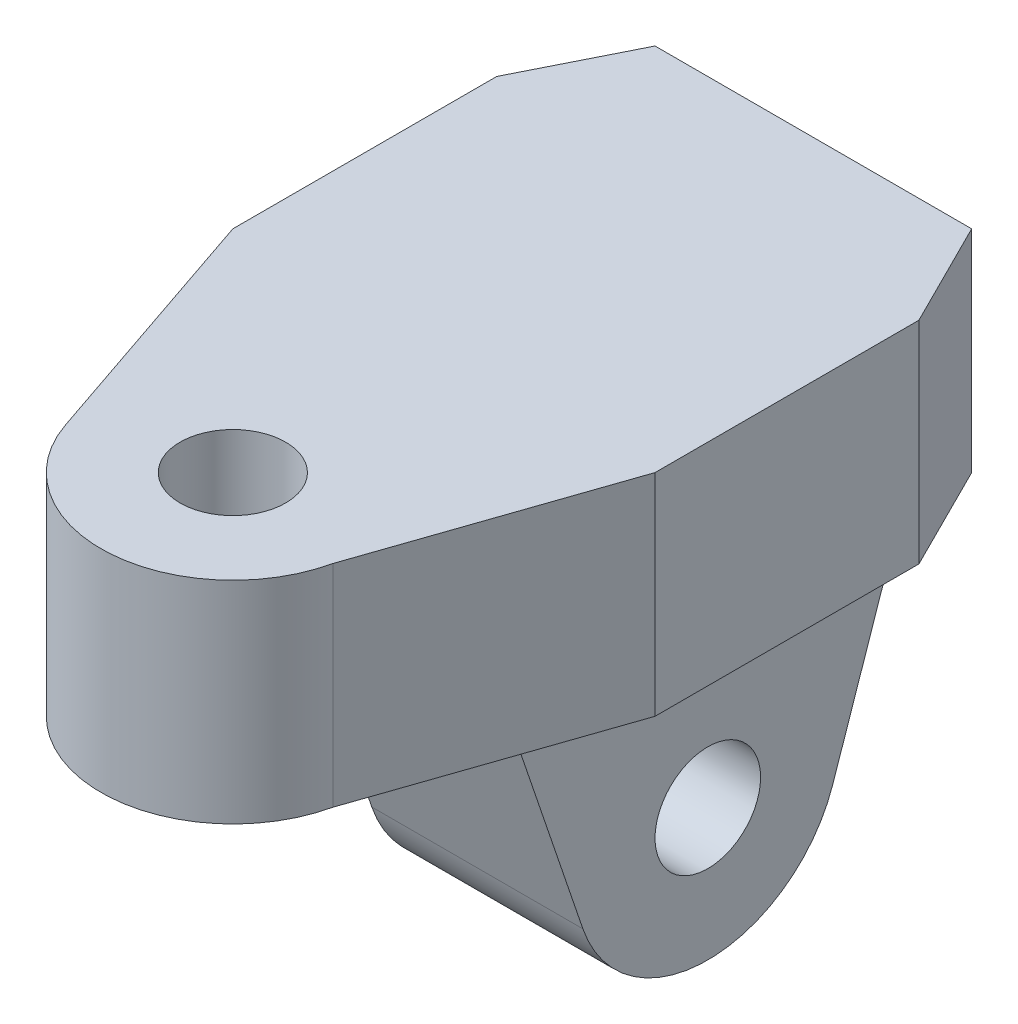
ISO-10303-21;
HEADER;
FILE_DESCRIPTION(('STEP AP214'),'2;1');
FILE_NAME('part.step','',(''),(''),'','','');
FILE_SCHEMA(('AUTOMOTIVE_DESIGN { 1 0 10303 214 1 1 1 1 }'));
ENDSEC;
DATA;
#1=APPLICATION_CONTEXT('core data for automotive mechanical design processes');
#2=APPLICATION_PROTOCOL_DEFINITION('international standard','automotive_design',2000,#1);
#3=PRODUCT_CONTEXT('',#1,'mechanical');
#4=PRODUCT('Part','Part','',(#3));
#5=PRODUCT_RELATED_PRODUCT_CATEGORY('part','',(#4));
#6=PRODUCT_DEFINITION_FORMATION('','',#4);
#7=PRODUCT_DEFINITION_CONTEXT('part definition',#1,'design');
#8=PRODUCT_DEFINITION('design','',#6,#7);
#9=PRODUCT_DEFINITION_SHAPE('','',#8);
#10=(LENGTH_UNIT() NAMED_UNIT(*) SI_UNIT(.MILLI.,.METRE.));
#11=(NAMED_UNIT(*) PLANE_ANGLE_UNIT() SI_UNIT($,.RADIAN.));
#12=(NAMED_UNIT(*) SI_UNIT($,.STERADIAN.) SOLID_ANGLE_UNIT());
#13=UNCERTAINTY_MEASURE_WITH_UNIT(LENGTH_MEASURE(1.E-05),#10,'distance_accuracy_value','');
#14=(GEOMETRIC_REPRESENTATION_CONTEXT(3) GLOBAL_UNCERTAINTY_ASSIGNED_CONTEXT((#13)) GLOBAL_UNIT_ASSIGNED_CONTEXT((#10,
#11,#12)) REPRESENTATION_CONTEXT('',''));
#15=CARTESIAN_POINT('',(0.,0.,0.));
#16=DIRECTION('',(0.,0.,1.));
#17=DIRECTION('',(1.,0.,0.));
#18=AXIS2_PLACEMENT_3D('',#15,#16,#17);
#19=CARTESIAN_POINT('',(0.,0.,-6.));
#20=DIRECTION('',(0.,0.,-1.));
#21=DIRECTION('',(0.,1.,0.));
#22=AXIS2_PLACEMENT_3D('',#19,#20,#21);
#23=PLANE('',#22);
#24=DIRECTION('',(-0.707106781186541,0.707106781186554,0.));
#25=VECTOR('',#24,1.);
#26=CARTESIAN_POINT('',(-9.,12.,-6.));
#27=LINE('',#26,#25);
#28=CARTESIAN_POINT('',(-6.,8.99999999999995,-6.));
#29=VERTEX_POINT('',#28);
#30=CARTESIAN_POINT('',(-9.,12.,-6.));
#31=VERTEX_POINT('',#30);
#32=EDGE_CURVE('E205',#29,#31,#27,.T.);
#33=ORIENTED_EDGE('',*,*,#32,.T.);
#34=DIRECTION('',(1.,0.,0.));
#35=VECTOR('',#34,1.);
#36=CARTESIAN_POINT('',(0.,12.,-6.));
#37=LINE('',#36,#35);
#38=CARTESIAN_POINT('',(-6.,12.,-6.));
#39=VERTEX_POINT('',#38);
#40=EDGE_CURVE('E11',#31,#39,#37,.T.);
#41=ORIENTED_EDGE('',*,*,#40,.T.);
#42=DIRECTION('',(0.,-1.,0.));
#43=VECTOR('',#42,1.);
#44=CARTESIAN_POINT('',(-6.,8.99999999999995,-6.));
#45=LINE('',#44,#43);
#46=EDGE_CURVE('E202',#39,#29,#45,.T.);
#47=ORIENTED_EDGE('',*,*,#46,.T.);
#48=EDGE_LOOP('',(#33,#41,#47));
#49=FACE_BOUND('',#48,.T.);
#50=ADVANCED_FACE('F33',(#49),#23,.T.);
#51=DIRECTION('',(0.,1.,0.));
#52=VECTOR('',#51,1.);
#53=CARTESIAN_POINT('',(6.,9.00000000000007,-6.));
#54=LINE('',#53,#52);
#55=CARTESIAN_POINT('',(6.,9.00000000000008,-6.));
#56=VERTEX_POINT('',#55);
#57=CARTESIAN_POINT('',(6.,12.,-6.));
#58=VERTEX_POINT('',#57);
#59=EDGE_CURVE('E48',#56,#58,#54,.T.);
#60=ORIENTED_EDGE('',*,*,#59,.T.);
#61=CARTESIAN_POINT('',(9.,12.,-6.));
#62=VERTEX_POINT('',#61);
#63=EDGE_CURVE('E37',#58,#62,#37,.T.);
#64=ORIENTED_EDGE('',*,*,#63,.T.);
#65=DIRECTION('',(-0.707106781186556,-0.707106781186539,0.));
#66=VECTOR('',#65,1.);
#67=CARTESIAN_POINT('',(9.,12.,-6.));
#68=LINE('',#67,#66);
#69=EDGE_CURVE('E198',#62,#56,#68,.T.);
#70=ORIENTED_EDGE('',*,*,#69,.T.);
#71=EDGE_LOOP('',(#60,#64,#70));
#72=FACE_BOUND('',#71,.T.);
#73=ADVANCED_FACE('F311',(#72),#23,.T.);
#74=CARTESIAN_POINT('',(6.,0.,0.));
#75=DIRECTION('',(1.,0.,0.));
#76=DIRECTION('',(0.,0.,-1.));
#77=AXIS2_PLACEMENT_3D('',#74,#75,#76);
#78=PLANE('',#77);
#79=ORIENTED_EDGE('',*,*,#59,.F.);
#80=DIRECTION('',(0.,0.,1.));
#81=VECTOR('',#80,1.);
#82=CARTESIAN_POINT('',(6.,9.00000000000007,-6.));
#83=LINE('',#82,#81);
#84=CARTESIAN_POINT('',(6.,8.99999999999995,6.));
#85=VERTEX_POINT('',#84);
#86=EDGE_CURVE('E53',#56,#85,#83,.T.);
#87=ORIENTED_EDGE('',*,*,#86,.T.);
#88=DIRECTION('',(0.,1.,0.));
#89=VECTOR('',#88,1.);
#90=CARTESIAN_POINT('',(6.,9.00000000000007,6.));
#91=LINE('',#90,#89);
#92=CARTESIAN_POINT('',(6.,12.,6.));
#93=VERTEX_POINT('',#92);
#94=EDGE_CURVE('E212',#85,#93,#91,.T.);
#95=ORIENTED_EDGE('',*,*,#94,.T.);
#96=DIRECTION('',(0.,0.,1.));
#97=VECTOR('',#96,1.);
#98=CARTESIAN_POINT('',(6.,12.,12.));
#99=LINE('',#98,#97);
#100=CARTESIAN_POINT('',(6.,12.,12.));
#101=VERTEX_POINT('',#100);
#102=EDGE_CURVE('E285',#93,#101,#99,.T.);
#103=ORIENTED_EDGE('',*,*,#102,.T.);
#104=DIRECTION('',(0.,-0.946805722818264,-0.321805722818264));
#105=VECTOR('',#104,1.);
#106=CARTESIAN_POINT('',(6.,12.,12.));
#107=LINE('',#106,#105);
#108=CARTESIAN_POINT('',(6.,-2.41354292113698,7.10104292113698));
#109=VERTEX_POINT('',#108);
#110=EDGE_CURVE('E277',#101,#109,#107,.T.);
#111=ORIENTED_EDGE('',*,*,#110,.T.);
#112=CARTESIAN_POINT('',(6.,0.,0.));
#113=DIRECTION('',(1.,0.,0.));
#114=DIRECTION('',(0.,0.,-1.));
#115=AXIS2_PLACEMENT_3D('',#112,#113,#114);
#116=CIRCLE('',#115,7.5);
#117=CARTESIAN_POINT('',(6.,-2.41354292113698,-7.10104292113697));
#118=VERTEX_POINT('',#117);
#119=EDGE_CURVE('E280',#109,#118,#116,.T.);
#120=ORIENTED_EDGE('',*,*,#119,.T.);
#121=DIRECTION('',(0.,0.946805722818264,-0.321805722818264));
#122=VECTOR('',#121,1.);
#123=CARTESIAN_POINT('',(6.,12.,-12.));
#124=LINE('',#123,#122);
#125=CARTESIAN_POINT('',(6.,12.,-12.));
#126=VERTEX_POINT('',#125);
#127=EDGE_CURVE('E283',#118,#126,#124,.T.);
#128=ORIENTED_EDGE('',*,*,#127,.T.);
#129=EDGE_CURVE('E286',#126,#58,#99,.T.);
#130=ORIENTED_EDGE('',*,*,#129,.T.);
#131=EDGE_LOOP('',(#79,#87,#95,#103,#111,#120,#128,#130));
#132=FACE_BOUND('',#131,.T.);
#133=CARTESIAN_POINT('',(6.,0.,0.));
#134=DIRECTION('',(1.,0.,0.));
#135=DIRECTION('',(0.,0.,-1.));
#136=AXIS2_PLACEMENT_3D('',#133,#134,#135);
#137=CIRCLE('',#136,3.);
#138=CARTESIAN_POINT('',(6.,0.,-3.));
#139=VERTEX_POINT('',#138);
#140=EDGE_CURVE('E271',#139,#139,#137,.T.);
#141=ORIENTED_EDGE('',*,*,#140,.F.);
#142=EDGE_LOOP('',(#141));
#143=FACE_BOUND('',#142,.T.);
#144=ADVANCED_FACE('F324',(#132,#143),#78,.T.);
#145=CARTESIAN_POINT('',(-6.,0.,0.));
#146=DIRECTION('',(1.,0.,0.));
#147=DIRECTION('',(0.,0.,-1.));
#148=AXIS2_PLACEMENT_3D('',#145,#146,#147);
#149=PLANE('',#148);
#150=DIRECTION('',(0.,0.,1.));
#151=VECTOR('',#150,1.);
#152=CARTESIAN_POINT('',(-6.,8.99999999999995,-6.));
#153=LINE('',#152,#151);
#154=CARTESIAN_POINT('',(-6.,8.99999999999995,6.));
#155=VERTEX_POINT('',#154);
#156=EDGE_CURVE('E220',#29,#155,#153,.T.);
#157=ORIENTED_EDGE('',*,*,#156,.F.);
#158=ORIENTED_EDGE('',*,*,#46,.F.);
#159=DIRECTION('',(0.,0.,1.));
#160=VECTOR('',#159,1.);
#161=CARTESIAN_POINT('',(-6.,12.,12.));
#162=LINE('',#161,#160);
#163=CARTESIAN_POINT('',(-6.,12.,-12.));
#164=VERTEX_POINT('',#163);
#165=EDGE_CURVE('E281',#164,#39,#162,.T.);
#166=ORIENTED_EDGE('',*,*,#165,.F.);
#167=DIRECTION('',(0.,0.946805722818264,-0.321805722818264));
#168=VECTOR('',#167,1.);
#169=CARTESIAN_POINT('',(-6.,12.,-12.));
#170=LINE('',#169,#168);
#171=CARTESIAN_POINT('',(-6.,-2.41354292113698,-7.10104292113697));
#172=VERTEX_POINT('',#171);
#173=EDGE_CURVE('E293',#172,#164,#170,.T.);
#174=ORIENTED_EDGE('',*,*,#173,.F.);
#175=CARTESIAN_POINT('',(-6.,0.,0.));
#176=DIRECTION('',(1.,0.,0.));
#177=DIRECTION('',(0.,0.,-1.));
#178=AXIS2_PLACEMENT_3D('',#175,#176,#177);
#179=CIRCLE('',#178,7.5);
#180=CARTESIAN_POINT('',(-6.,-2.41354292113698,7.10104292113698));
#181=VERTEX_POINT('',#180);
#182=EDGE_CURVE('E291',#181,#172,#179,.T.);
#183=ORIENTED_EDGE('',*,*,#182,.F.);
#184=DIRECTION('',(0.,-0.946805722818264,-0.321805722818264));
#185=VECTOR('',#184,1.);
#186=CARTESIAN_POINT('',(-6.,12.,12.));
#187=LINE('',#186,#185);
#188=CARTESIAN_POINT('',(-6.,12.,12.));
#189=VERTEX_POINT('',#188);
#190=EDGE_CURVE('E274',#189,#181,#187,.T.);
#191=ORIENTED_EDGE('',*,*,#190,.F.);
#192=CARTESIAN_POINT('',(-5.99999999999999,12.,6.));
#193=VERTEX_POINT('',#192);
#194=EDGE_CURVE('E295',#193,#189,#162,.T.);
#195=ORIENTED_EDGE('',*,*,#194,.F.);
#196=DIRECTION('',(0.,-1.,0.));
#197=VECTOR('',#196,1.);
#198=CARTESIAN_POINT('',(-6.,8.99999999999995,6.));
#199=LINE('',#198,#197);
#200=EDGE_CURVE('E214',#193,#155,#199,.T.);
#201=ORIENTED_EDGE('',*,*,#200,.T.);
#202=EDGE_LOOP('',(#157,#158,#166,#174,#183,#191,#195,#201));
#203=FACE_BOUND('',#202,.T.);
#204=CARTESIAN_POINT('',(-6.,0.,0.));
#205=DIRECTION('',(1.,0.,0.));
#206=DIRECTION('',(0.,0.,-1.));
#207=AXIS2_PLACEMENT_3D('',#204,#205,#206);
#208=CIRCLE('',#207,3.);
#209=CARTESIAN_POINT('',(-6.,0.,-3.));
#210=VERTEX_POINT('',#209);
#211=EDGE_CURVE('E270',#210,#210,#208,.T.);
#212=ORIENTED_EDGE('',*,*,#211,.T.);
#213=EDGE_LOOP('',(#212));
#214=FACE_BOUND('',#213,.T.);
#215=ADVANCED_FACE('F333',(#203,#214),#149,.F.);
#216=CARTESIAN_POINT('',(6.,12.,12.));
#217=DIRECTION('',(0.,0.321805722818264,-0.946805722818264));
#218=DIRECTION('',(0.,0.946805722818264,0.321805722818264));
#219=AXIS2_PLACEMENT_3D('',#216,#217,#218);
#220=PLANE('',#219);
#221=ORIENTED_EDGE('',*,*,#190,.T.);
#222=DIRECTION('',(-1.,0.,0.));
#223=VECTOR('',#222,1.);
#224=CARTESIAN_POINT('',(6.,-2.41354292113698,7.10104292113698));
#225=LINE('',#224,#223);
#226=EDGE_CURVE('E304',#109,#181,#225,.T.);
#227=ORIENTED_EDGE('',*,*,#226,.F.);
#228=ORIENTED_EDGE('',*,*,#110,.F.);
#229=DIRECTION('',(-1.,0.,0.));
#230=VECTOR('',#229,1.);
#231=CARTESIAN_POINT('',(6.,12.,12.));
#232=LINE('',#231,#230);
#233=EDGE_CURVE('E288',#101,#189,#232,.T.);
#234=ORIENTED_EDGE('',*,*,#233,.T.);
#235=EDGE_LOOP('',(#221,#227,#228,#234));
#236=FACE_BOUND('',#235,.T.);
#237=ADVANCED_FACE('F35',(#236),#220,.F.);
#238=CARTESIAN_POINT('',(6.,0.,0.));
#239=DIRECTION('',(-1.,0.,0.));
#240=DIRECTION('',(0.,0.,1.));
#241=AXIS2_PLACEMENT_3D('',#238,#239,#240);
#242=CYLINDRICAL_SURFACE('',#241,7.5);
#243=ORIENTED_EDGE('',*,*,#182,.T.);
#244=DIRECTION('',(-1.,0.,0.));
#245=VECTOR('',#244,1.);
#246=CARTESIAN_POINT('',(6.,-2.41354292113698,-7.10104292113697));
#247=LINE('',#246,#245);
#248=EDGE_CURVE('E302',#118,#172,#247,.T.);
#249=ORIENTED_EDGE('',*,*,#248,.F.);
#250=ORIENTED_EDGE('',*,*,#119,.F.);
#251=ORIENTED_EDGE('',*,*,#226,.T.);
#252=EDGE_LOOP('',(#243,#249,#250,#251));
#253=FACE_BOUND('',#252,.T.);
#254=ADVANCED_FACE('F338',(#253),#242,.T.);
#255=CARTESIAN_POINT('',(6.,12.,-12.));
#256=DIRECTION('',(0.,0.321805722818264,0.946805722818264));
#257=DIRECTION('',(0.,-0.946805722818264,0.321805722818264));
#258=AXIS2_PLACEMENT_3D('',#255,#256,#257);
#259=PLANE('',#258);
#260=ORIENTED_EDGE('',*,*,#173,.T.);
#261=DIRECTION('',(-1.,0.,0.));
#262=VECTOR('',#261,1.);
#263=CARTESIAN_POINT('',(6.,12.,-12.));
#264=LINE('',#263,#262);
#265=EDGE_CURVE('E299',#126,#164,#264,.T.);
#266=ORIENTED_EDGE('',*,*,#265,.F.);
#267=ORIENTED_EDGE('',*,*,#127,.F.);
#268=ORIENTED_EDGE('',*,*,#248,.T.);
#269=EDGE_LOOP('',(#260,#266,#267,#268));
#270=FACE_BOUND('',#269,.T.);
#271=ADVANCED_FACE('F341',(#270),#259,.F.);
#272=CARTESIAN_POINT('',(6.,0.,0.));
#273=DIRECTION('',(-1.,0.,0.));
#274=DIRECTION('',(0.,0.,1.));
#275=AXIS2_PLACEMENT_3D('',#272,#273,#274);
#276=CYLINDRICAL_SURFACE('',#275,3.);
#277=ORIENTED_EDGE('',*,*,#140,.T.);
#278=EDGE_LOOP('',(#277));
#279=FACE_BOUND('',#278,.T.);
#280=ORIENTED_EDGE('',*,*,#211,.F.);
#281=EDGE_LOOP('',(#280));
#282=FACE_BOUND('',#281,.T.);
#283=ADVANCED_FACE('F452',(#279,#282),#276,.F.);
#284=CARTESIAN_POINT('',(0.,12.,21.));
#285=DIRECTION('',(0.,1.,0.));
#286=DIRECTION('',(0.,0.,1.));
#287=AXIS2_PLACEMENT_3D('',#284,#285,#286);
#288=PLANE('',#287);
#289=CARTESIAN_POINT('',(0.,12.,21.));
#290=DIRECTION('',(0.,1.,0.));
#291=DIRECTION('',(0.,0.,1.));
#292=AXIS2_PLACEMENT_3D('',#289,#290,#291);
#293=CIRCLE('',#292,3.);
#294=CARTESIAN_POINT('',(0.,12.,24.));
#295=VERTEX_POINT('',#294);
#296=EDGE_CURVE('E238',#295,#295,#293,.T.);
#297=ORIENTED_EDGE('',*,*,#296,.T.);
#298=EDGE_LOOP('',(#297));
#299=FACE_BOUND('',#298,.T.);
#300=DIRECTION('',(0.321805722818264,0.,0.946805722818264));
#301=VECTOR('',#300,1.);
#302=CARTESIAN_POINT('',(-12.,12.,9.));
#303=LINE('',#302,#301);
#304=CARTESIAN_POINT('',(-12.,12.,9.));
#305=VERTEX_POINT('',#304);
#306=CARTESIAN_POINT('',(-7.10104292113698,12.,23.413542921137));
#307=VERTEX_POINT('',#306);
#308=EDGE_CURVE('E242',#305,#307,#303,.T.);
#309=ORIENTED_EDGE('',*,*,#308,.F.);
#310=DIRECTION('',(0.,0.,1.));
#311=VECTOR('',#310,1.);
#312=CARTESIAN_POINT('',(-12.,12.,6.));
#313=LINE('',#312,#311);
#314=CARTESIAN_POINT('',(-12.,12.,-6.));
#315=VERTEX_POINT('',#314);
#316=EDGE_CURVE('E234',#315,#305,#313,.T.);
#317=ORIENTED_EDGE('',*,*,#316,.F.);
#318=DIRECTION('',(-0.447213595499958,0.,0.894427190999916));
#319=VECTOR('',#318,1.);
#320=CARTESIAN_POINT('',(-9.,12.,-12.));
#321=LINE('',#320,#319);
#322=CARTESIAN_POINT('',(-9.,12.,-12.));
#323=VERTEX_POINT('',#322);
#324=EDGE_CURVE('E189',#323,#315,#321,.T.);
#325=ORIENTED_EDGE('',*,*,#324,.F.);
#326=DIRECTION('',(-1.,0.,0.));
#327=VECTOR('',#326,1.);
#328=CARTESIAN_POINT('',(9.,12.,-12.));
#329=LINE('',#328,#327);
#330=EDGE_CURVE('E193',#164,#323,#329,.T.);
#331=ORIENTED_EDGE('',*,*,#330,.F.);
#332=ORIENTED_EDGE('',*,*,#165,.T.);
#333=ORIENTED_EDGE('',*,*,#40,.F.);
#334=DIRECTION('',(0.,0.,1.));
#335=VECTOR('',#334,1.);
#336=CARTESIAN_POINT('',(-9.,12.,-6.));
#337=LINE('',#336,#335);
#338=CARTESIAN_POINT('',(-8.99999999999999,12.,6.));
#339=VERTEX_POINT('',#338);
#340=EDGE_CURVE('E210',#31,#339,#337,.T.);
#341=ORIENTED_EDGE('',*,*,#340,.T.);
#342=DIRECTION('',(-1.,0.,0.));
#343=VECTOR('',#342,1.);
#344=CARTESIAN_POINT('',(12.,12.,6.));
#345=LINE('',#344,#343);
#346=EDGE_CURVE('E227',#193,#339,#345,.T.);
#347=ORIENTED_EDGE('',*,*,#346,.F.);
#348=ORIENTED_EDGE('',*,*,#194,.T.);
#349=ORIENTED_EDGE('',*,*,#233,.F.);
#350=ORIENTED_EDGE('',*,*,#102,.F.);
#351=CARTESIAN_POINT('',(9.,12.,6.));
#352=VERTEX_POINT('',#351);
#353=EDGE_CURVE('E228',#352,#93,#345,.T.);
#354=ORIENTED_EDGE('',*,*,#353,.F.);
#355=DIRECTION('',(0.,0.,1.));
#356=VECTOR('',#355,1.);
#357=CARTESIAN_POINT('',(9.,12.,-6.));
#358=LINE('',#357,#356);
#359=EDGE_CURVE('E224',#62,#352,#358,.T.);
#360=ORIENTED_EDGE('',*,*,#359,.F.);
#361=ORIENTED_EDGE('',*,*,#63,.F.);
#362=ORIENTED_EDGE('',*,*,#129,.F.);
#363=CARTESIAN_POINT('',(9.,12.,-12.));
#364=VERTEX_POINT('',#363);
#365=EDGE_CURVE('E194',#364,#126,#329,.T.);
#366=ORIENTED_EDGE('',*,*,#365,.F.);
#367=DIRECTION('',(-0.447213595499958,0.,-0.894427190999916));
#368=VECTOR('',#367,1.);
#369=CARTESIAN_POINT('',(12.,12.,-6.));
#370=LINE('',#369,#368);
#371=CARTESIAN_POINT('',(12.,12.,-6.));
#372=VERTEX_POINT('',#371);
#373=EDGE_CURVE('E175',#372,#364,#370,.T.);
#374=ORIENTED_EDGE('',*,*,#373,.F.);
#375=DIRECTION('',(0.,0.,1.));
#376=VECTOR('',#375,1.);
#377=CARTESIAN_POINT('',(12.,12.,6.));
#378=LINE('',#377,#376);
#379=CARTESIAN_POINT('',(12.,12.,9.));
#380=VERTEX_POINT('',#379);
#381=EDGE_CURVE('E236',#372,#380,#378,.T.);
#382=ORIENTED_EDGE('',*,*,#381,.T.);
#383=DIRECTION('',(0.324651995250833,0.,-0.945833538197739));
#384=VECTOR('',#383,1.);
#385=CARTESIAN_POINT('',(12.,12.,9.));
#386=LINE('',#385,#384);
#387=CARTESIAN_POINT('',(7.31915304326845,12.,22.6370701662465));
#388=VERTEX_POINT('',#387);
#389=EDGE_CURVE('E248',#388,#380,#386,.T.);
#390=ORIENTED_EDGE('',*,*,#389,.F.);
#391=CARTESIAN_POINT('',(0.,12.,21.));
#392=DIRECTION('',(0.,1.,0.));
#393=DIRECTION('',(0.,0.,1.));
#394=AXIS2_PLACEMENT_3D('',#391,#392,#393);
#395=CIRCLE('',#394,7.5);
#396=EDGE_CURVE('E255',#307,#388,#395,.T.);
#397=ORIENTED_EDGE('',*,*,#396,.F.);
#398=EDGE_LOOP('',(#309,#317,#325,#331,#332,#333,#341,#347,#348,#349,#350,#354,#360,#361,#362,
#366,#374,#382,#390,#397));
#399=FACE_BOUND('',#398,.T.);
#400=ADVANCED_FACE('F316',(#299,#399),#288,.F.);
#401=CARTESIAN_POINT('',(0.,24.,21.));
#402=DIRECTION('',(0.,1.,0.));
#403=DIRECTION('',(0.,0.,1.));
#404=AXIS2_PLACEMENT_3D('',#401,#402,#403);
#405=PLANE('',#404);
#406=DIRECTION('',(0.321805722818264,0.,0.946805722818264));
#407=VECTOR('',#406,1.);
#408=CARTESIAN_POINT('',(-12.,24.,9.00000000000001));
#409=LINE('',#408,#407);
#410=CARTESIAN_POINT('',(-12.,24.,9.00000000000001));
#411=VERTEX_POINT('',#410);
#412=CARTESIAN_POINT('',(-7.10104292113698,24.,23.413542921137));
#413=VERTEX_POINT('',#412);
#414=EDGE_CURVE('E245',#411,#413,#409,.T.);
#415=ORIENTED_EDGE('',*,*,#414,.T.);
#416=CARTESIAN_POINT('',(0.,24.,21.));
#417=DIRECTION('',(0.,1.,0.));
#418=DIRECTION('',(0.,0.,1.));
#419=AXIS2_PLACEMENT_3D('',#416,#417,#418);
#420=CIRCLE('',#419,7.5);
#421=CARTESIAN_POINT('',(7.31915304326845,24.,22.6370701662465));
#422=VERTEX_POINT('',#421);
#423=EDGE_CURVE('E247',#413,#422,#420,.T.);
#424=ORIENTED_EDGE('',*,*,#423,.T.);
#425=DIRECTION('',(0.324651995250833,0.,-0.945833538197739));
#426=VECTOR('',#425,1.);
#427=CARTESIAN_POINT('',(12.,24.,9.00000000000001));
#428=LINE('',#427,#426);
#429=CARTESIAN_POINT('',(12.,24.,9.00000000000001));
#430=VERTEX_POINT('',#429);
#431=EDGE_CURVE('E250',#422,#430,#428,.T.);
#432=ORIENTED_EDGE('',*,*,#431,.T.);
#433=DIRECTION('',(0.,0.,1.));
#434=VECTOR('',#433,1.);
#435=CARTESIAN_POINT('',(12.,24.,6.));
#436=LINE('',#435,#434);
#437=CARTESIAN_POINT('',(12.,24.,-6.));
#438=VERTEX_POINT('',#437);
#439=EDGE_CURVE('E165',#438,#430,#436,.T.);
#440=ORIENTED_EDGE('',*,*,#439,.F.);
#441=DIRECTION('',(-0.447213595499958,0.,-0.894427190999916));
#442=VECTOR('',#441,1.);
#443=CARTESIAN_POINT('',(12.,24.,-6.));
#444=LINE('',#443,#442);
#445=CARTESIAN_POINT('',(9.,24.,-12.));
#446=VERTEX_POINT('',#445);
#447=EDGE_CURVE('E155',#438,#446,#444,.T.);
#448=ORIENTED_EDGE('',*,*,#447,.T.);
#449=DIRECTION('',(-1.,0.,0.));
#450=VECTOR('',#449,1.);
#451=CARTESIAN_POINT('',(9.,24.,-12.));
#452=LINE('',#451,#450);
#453=CARTESIAN_POINT('',(-9.,24.,-12.));
#454=VERTEX_POINT('',#453);
#455=EDGE_CURVE('E162',#446,#454,#452,.T.);
#456=ORIENTED_EDGE('',*,*,#455,.T.);
#457=DIRECTION('',(-0.447213595499958,0.,0.894427190999916));
#458=VECTOR('',#457,1.);
#459=CARTESIAN_POINT('',(-9.,24.,-12.));
#460=LINE('',#459,#458);
#461=CARTESIAN_POINT('',(-12.,24.,-6.));
#462=VERTEX_POINT('',#461);
#463=EDGE_CURVE('E169',#454,#462,#460,.T.);
#464=ORIENTED_EDGE('',*,*,#463,.T.);
#465=DIRECTION('',(0.,0.,1.));
#466=VECTOR('',#465,1.);
#467=CARTESIAN_POINT('',(-12.,24.,6.));
#468=LINE('',#467,#466);
#469=EDGE_CURVE('E232',#462,#411,#468,.T.);
#470=ORIENTED_EDGE('',*,*,#469,.T.);
#471=EDGE_LOOP('',(#415,#424,#432,#440,#448,#456,#464,#470));
#472=FACE_BOUND('',#471,.T.);
#473=CARTESIAN_POINT('',(0.,24.,21.));
#474=DIRECTION('',(0.,1.,0.));
#475=DIRECTION('',(0.,0.,1.));
#476=AXIS2_PLACEMENT_3D('',#473,#474,#475);
#477=CIRCLE('',#476,3.);
#478=CARTESIAN_POINT('',(0.,24.,24.));
#479=VERTEX_POINT('',#478);
#480=EDGE_CURVE('E239',#479,#479,#477,.T.);
#481=ORIENTED_EDGE('',*,*,#480,.F.);
#482=EDGE_LOOP('',(#481));
#483=FACE_BOUND('',#482,.T.);
#484=ADVANCED_FACE('F158',(#472,#483),#405,.T.);
#485=CARTESIAN_POINT('',(-12.,24.,9.00000000000001));
#486=DIRECTION('',(0.946805722818264,0.,-0.321805722818264));
#487=DIRECTION('',(-0.321805722818264,0.,-0.946805722818264));
#488=AXIS2_PLACEMENT_3D('',#485,#486,#487);
#489=PLANE('',#488);
#490=ORIENTED_EDGE('',*,*,#308,.T.);
#491=DIRECTION('',(0.,-1.,0.));
#492=VECTOR('',#491,1.);
#493=CARTESIAN_POINT('',(-7.10104292113698,24.,23.413542921137));
#494=LINE('',#493,#492);
#495=EDGE_CURVE('E267',#413,#307,#494,.T.);
#496=ORIENTED_EDGE('',*,*,#495,.F.);
#497=ORIENTED_EDGE('',*,*,#414,.F.);
#498=DIRECTION('',(0.,-1.,0.));
#499=VECTOR('',#498,1.);
#500=CARTESIAN_POINT('',(-12.,24.,9.00000000000001));
#501=LINE('',#500,#499);
#502=EDGE_CURVE('E252',#411,#305,#501,.T.);
#503=ORIENTED_EDGE('',*,*,#502,.T.);
#504=EDGE_LOOP('',(#490,#496,#497,#503));
#505=FACE_BOUND('',#504,.T.);
#506=ADVANCED_FACE('F358',(#505),#489,.F.);
#507=CARTESIAN_POINT('',(0.,24.,21.));
#508=DIRECTION('',(0.,-1.,0.));
#509=DIRECTION('',(0.,0.,-1.));
#510=AXIS2_PLACEMENT_3D('',#507,#508,#509);
#511=CYLINDRICAL_SURFACE('',#510,7.5);
#512=ORIENTED_EDGE('',*,*,#396,.T.);
#513=DIRECTION('',(0.,-1.,0.));
#514=VECTOR('',#513,1.);
#515=CARTESIAN_POINT('',(7.31915304326845,24.,22.6370701662465));
#516=LINE('',#515,#514);
#517=EDGE_CURVE('E264',#422,#388,#516,.T.);
#518=ORIENTED_EDGE('',*,*,#517,.F.);
#519=ORIENTED_EDGE('',*,*,#423,.F.);
#520=ORIENTED_EDGE('',*,*,#495,.T.);
#521=EDGE_LOOP('',(#512,#518,#519,#520));
#522=FACE_BOUND('',#521,.T.);
#523=ADVANCED_FACE('F353',(#522),#511,.T.);
#524=CARTESIAN_POINT('',(12.,24.,9.00000000000001));
#525=DIRECTION('',(-0.945833538197739,0.,-0.324651995250833));
#526=DIRECTION('',(-0.324651995250833,0.,0.945833538197739));
#527=AXIS2_PLACEMENT_3D('',#524,#525,#526);
#528=PLANE('',#527);
#529=ORIENTED_EDGE('',*,*,#389,.T.);
#530=DIRECTION('',(0.,-1.,0.));
#531=VECTOR('',#530,1.);
#532=CARTESIAN_POINT('',(12.,24.,9.00000000000001));
#533=LINE('',#532,#531);
#534=EDGE_CURVE('E261',#430,#380,#533,.T.);
#535=ORIENTED_EDGE('',*,*,#534,.F.);
#536=ORIENTED_EDGE('',*,*,#431,.F.);
#537=ORIENTED_EDGE('',*,*,#517,.T.);
#538=EDGE_LOOP('',(#529,#535,#536,#537));
#539=FACE_BOUND('',#538,.T.);
#540=ADVANCED_FACE('F350',(#539),#528,.F.);
#541=CARTESIAN_POINT('',(0.,24.,21.));
#542=DIRECTION('',(0.,-1.,0.));
#543=DIRECTION('',(0.,0.,-1.));
#544=AXIS2_PLACEMENT_3D('',#541,#542,#543);
#545=CYLINDRICAL_SURFACE('',#544,3.);
#546=ORIENTED_EDGE('',*,*,#480,.T.);
#547=EDGE_LOOP('',(#546));
#548=FACE_BOUND('',#547,.T.);
#549=ORIENTED_EDGE('',*,*,#296,.F.);
#550=EDGE_LOOP('',(#549));
#551=FACE_BOUND('',#550,.T.);
#552=ADVANCED_FACE('F478',(#548,#551),#545,.F.);
#553=CARTESIAN_POINT('',(12.,24.,6.));
#554=DIRECTION('',(-1.,0.,0.));
#555=DIRECTION('',(0.,0.,1.));
#556=AXIS2_PLACEMENT_3D('',#553,#554,#555);
#557=PLANE('',#556);
#558=ORIENTED_EDGE('',*,*,#534,.T.);
#559=ORIENTED_EDGE('',*,*,#381,.F.);
#560=DIRECTION('',(0.,-1.,0.));
#561=VECTOR('',#560,1.);
#562=CARTESIAN_POINT('',(12.,24.,-6.));
#563=LINE('',#562,#561);
#564=EDGE_CURVE('E196',#438,#372,#563,.T.);
#565=ORIENTED_EDGE('',*,*,#564,.F.);
#566=ORIENTED_EDGE('',*,*,#439,.T.);
#567=EDGE_LOOP('',(#558,#559,#565,#566));
#568=FACE_BOUND('',#567,.T.);
#569=ADVANCED_FACE('F347',(#568),#557,.F.);
#570=CARTESIAN_POINT('',(-12.,12.,6.));
#571=DIRECTION('',(1.,0.,0.));
#572=DIRECTION('',(0.,0.,-1.));
#573=AXIS2_PLACEMENT_3D('',#570,#571,#572);
#574=PLANE('',#573);
#575=ORIENTED_EDGE('',*,*,#502,.F.);
#576=ORIENTED_EDGE('',*,*,#469,.F.);
#577=DIRECTION('',(0.,1.,0.));
#578=VECTOR('',#577,1.);
#579=CARTESIAN_POINT('',(-12.,12.,-6.));
#580=LINE('',#579,#578);
#581=EDGE_CURVE('E207',#315,#462,#580,.T.);
#582=ORIENTED_EDGE('',*,*,#581,.F.);
#583=ORIENTED_EDGE('',*,*,#316,.T.);
#584=EDGE_LOOP('',(#575,#576,#582,#583));
#585=FACE_BOUND('',#584,.T.);
#586=ADVANCED_FACE('F362',(#585),#574,.F.);
#587=CARTESIAN_POINT('',(0.,0.,6.));
#588=DIRECTION('',(0.,0.,-1.));
#589=DIRECTION('',(0.,1.,0.));
#590=AXIS2_PLACEMENT_3D('',#587,#588,#589);
#591=PLANE('',#590);
#592=DIRECTION('',(-0.707106781186556,-0.707106781186539,0.));
#593=VECTOR('',#592,1.);
#594=CARTESIAN_POINT('',(9.,12.,6.));
#595=LINE('',#594,#593);
#596=EDGE_CURVE('E179',#352,#85,#595,.T.);
#597=ORIENTED_EDGE('',*,*,#596,.F.);
#598=ORIENTED_EDGE('',*,*,#353,.T.);
#599=ORIENTED_EDGE('',*,*,#94,.F.);
#600=EDGE_LOOP('',(#597,#598,#599));
#601=FACE_BOUND('',#600,.T.);
#602=ADVANCED_FACE('F323',(#601),#591,.F.);
#603=ORIENTED_EDGE('',*,*,#200,.F.);
#604=ORIENTED_EDGE('',*,*,#346,.T.);
#605=DIRECTION('',(-0.707106781186541,0.707106781186554,0.));
#606=VECTOR('',#605,1.);
#607=CARTESIAN_POINT('',(-9.,12.,6.));
#608=LINE('',#607,#606);
#609=EDGE_CURVE('E199',#155,#339,#608,.T.);
#610=ORIENTED_EDGE('',*,*,#609,.F.);
#611=EDGE_LOOP('',(#603,#604,#610));
#612=FACE_BOUND('',#611,.T.);
#613=ADVANCED_FACE('F375',(#612),#591,.F.);
#614=CARTESIAN_POINT('',(9.,12.,-6.));
#615=DIRECTION('',(-0.707106781186539,0.707106781186556,0.));
#616=DIRECTION('',(-0.707106781186556,-0.707106781186539,0.));
#617=AXIS2_PLACEMENT_3D('',#614,#615,#616);
#618=PLANE('',#617);
#619=ORIENTED_EDGE('',*,*,#596,.T.);
#620=ORIENTED_EDGE('',*,*,#86,.F.);
#621=ORIENTED_EDGE('',*,*,#69,.F.);
#622=ORIENTED_EDGE('',*,*,#359,.T.);
#623=EDGE_LOOP('',(#619,#620,#621,#622));
#624=FACE_BOUND('',#623,.T.);
#625=ADVANCED_FACE('F320',(#624),#618,.F.);
#626=CARTESIAN_POINT('',(-9.,12.,-6.));
#627=DIRECTION('',(0.707106781186554,0.707106781186541,0.));
#628=DIRECTION('',(-0.707106781186541,0.707106781186554,0.));
#629=AXIS2_PLACEMENT_3D('',#626,#627,#628);
#630=PLANE('',#629);
#631=ORIENTED_EDGE('',*,*,#609,.T.);
#632=ORIENTED_EDGE('',*,*,#340,.F.);
#633=ORIENTED_EDGE('',*,*,#32,.F.);
#634=ORIENTED_EDGE('',*,*,#156,.T.);
#635=EDGE_LOOP('',(#631,#632,#633,#634));
#636=FACE_BOUND('',#635,.T.);
#637=ADVANCED_FACE('F371',(#636),#630,.F.);
#638=CARTESIAN_POINT('',(-9.,24.,-12.));
#639=DIRECTION('',(0.894427190999916,0.,0.447213595499958));
#640=DIRECTION('',(0.447213595499958,0.,-0.894427190999916));
#641=AXIS2_PLACEMENT_3D('',#638,#639,#640);
#642=PLANE('',#641);
#643=ORIENTED_EDGE('',*,*,#324,.T.);
#644=ORIENTED_EDGE('',*,*,#581,.T.);
#645=ORIENTED_EDGE('',*,*,#463,.F.);
#646=DIRECTION('',(0.,-1.,0.));
#647=VECTOR('',#646,1.);
#648=CARTESIAN_POINT('',(-9.,24.,-12.));
#649=LINE('',#648,#647);
#650=EDGE_CURVE('E180',#454,#323,#649,.T.);
#651=ORIENTED_EDGE('',*,*,#650,.T.);
#652=EDGE_LOOP('',(#643,#644,#645,#651));
#653=FACE_BOUND('',#652,.T.);
#654=ADVANCED_FACE('F364',(#653),#642,.F.);
#655=CARTESIAN_POINT('',(12.,24.,-6.));
#656=DIRECTION('',(-0.894427190999916,0.,0.447213595499958));
#657=DIRECTION('',(0.447213595499958,0.,0.894427190999916));
#658=AXIS2_PLACEMENT_3D('',#655,#656,#657);
#659=PLANE('',#658);
#660=ORIENTED_EDGE('',*,*,#373,.T.);
#661=DIRECTION('',(0.,-1.,0.));
#662=VECTOR('',#661,1.);
#663=CARTESIAN_POINT('',(9.,24.,-12.));
#664=LINE('',#663,#662);
#665=EDGE_CURVE('E172',#446,#364,#664,.T.);
#666=ORIENTED_EDGE('',*,*,#665,.F.);
#667=ORIENTED_EDGE('',*,*,#447,.F.);
#668=ORIENTED_EDGE('',*,*,#564,.T.);
#669=EDGE_LOOP('',(#660,#666,#667,#668));
#670=FACE_BOUND('',#669,.T.);
#671=ADVANCED_FACE('F173',(#670),#659,.F.);
#672=CARTESIAN_POINT('',(9.,24.,-12.));
#673=DIRECTION('',(0.,0.,1.));
#674=DIRECTION('',(0.,-1.,0.));
#675=AXIS2_PLACEMENT_3D('',#672,#673,#674);
#676=PLANE('',#675);
#677=ORIENTED_EDGE('',*,*,#365,.T.);
#678=ORIENTED_EDGE('',*,*,#265,.T.);
#679=ORIENTED_EDGE('',*,*,#330,.T.);
#680=ORIENTED_EDGE('',*,*,#650,.F.);
#681=ORIENTED_EDGE('',*,*,#455,.F.);
#682=ORIENTED_EDGE('',*,*,#665,.T.);
#683=EDGE_LOOP('',(#677,#678,#679,#680,#681,#682));
#684=FACE_BOUND('',#683,.T.);
#685=ADVANCED_FACE('F182',(#684),#676,.F.);
#686=CLOSED_SHELL('',(#50,#73,#144,#215,#237,#254,#271,#283,#400,#484,#506,#523,#540,#552,#569,
#586,#602,#613,#625,#637,#654,#671,#685));
#687=MANIFOLD_SOLID_BREP('B2',#686);
#688=ADVANCED_BREP_SHAPE_REPRESENTATION('',(#18,#687),#14);
#689=SHAPE_DEFINITION_REPRESENTATION(#9,#688);
ENDSEC;
END-ISO-10303-21;
